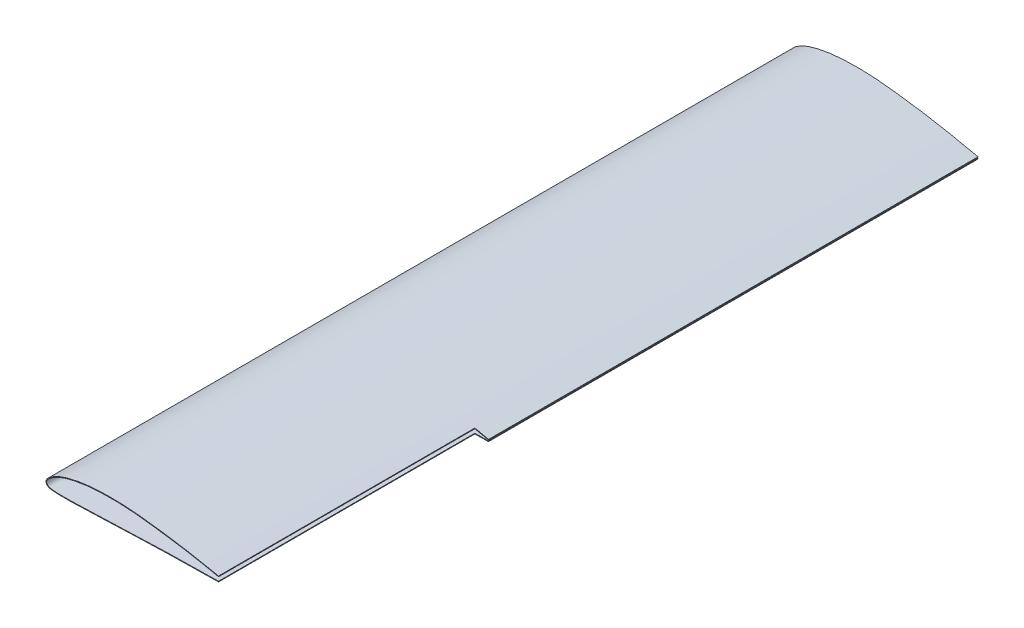
ISO-10303-21;
HEADER;
FILE_DESCRIPTION(('STEP AP214'),'2;1');
FILE_NAME('part.step','',(''),(''),'','','');
FILE_SCHEMA(('AUTOMOTIVE_DESIGN { 1 0 10303 214 1 1 1 1 }'));
ENDSEC;
DATA;
#1=APPLICATION_CONTEXT('core data for automotive mechanical design processes');
#2=APPLICATION_PROTOCOL_DEFINITION('international standard','automotive_design',2000,#1);
#3=PRODUCT_CONTEXT('',#1,'mechanical');
#4=PRODUCT('Part','Part','',(#3));
#5=PRODUCT_RELATED_PRODUCT_CATEGORY('part','',(#4));
#6=PRODUCT_DEFINITION_FORMATION('','',#4);
#7=PRODUCT_DEFINITION_CONTEXT('part definition',#1,'design');
#8=PRODUCT_DEFINITION('design','',#6,#7);
#9=PRODUCT_DEFINITION_SHAPE('','',#8);
#10=(LENGTH_UNIT() NAMED_UNIT(*) SI_UNIT(.MILLI.,.METRE.));
#11=(NAMED_UNIT(*) PLANE_ANGLE_UNIT() SI_UNIT($,.RADIAN.));
#12=(NAMED_UNIT(*) SI_UNIT($,.STERADIAN.) SOLID_ANGLE_UNIT());
#13=UNCERTAINTY_MEASURE_WITH_UNIT(LENGTH_MEASURE(1.E-05),#10,'distance_accuracy_value','');
#14=(GEOMETRIC_REPRESENTATION_CONTEXT(3) GLOBAL_UNCERTAINTY_ASSIGNED_CONTEXT((#13)) GLOBAL_UNIT_ASSIGNED_CONTEXT((#10,
#11,#12)) REPRESENTATION_CONTEXT('',''));
#15=CARTESIAN_POINT('',(0.,0.,0.));
#16=DIRECTION('',(0.,0.,1.));
#17=DIRECTION('',(1.,0.,0.));
#18=AXIS2_PLACEMENT_3D('',#15,#16,#17);
#19=CARTESIAN_POINT('',(152.092237140585,-4.00961778666245,1158.));
#20=DIRECTION('',(-0.976017079346762,0.217693961384825,0.));
#21=DIRECTION('',(-0.217693961384825,-0.976017079346762,0.));
#22=AXIS2_PLACEMENT_3D('',#19,#20,#21);
#23=PLANE('',#22);
#24=DIRECTION('',(0.217693961384825,0.976017079346762,0.));
#25=VECTOR('',#24,1.);
#26=CARTESIAN_POINT('',(152.092237140585,-4.00961778666245,760.));
#27=LINE('',#26,#25);
#28=CARTESIAN_POINT('',(151.8745431792,-4.98563486600921,760.));
#29=VERTEX_POINT('',#28);
#30=CARTESIAN_POINT('',(152.092237140585,-4.00961778666245,760.));
#31=VERTEX_POINT('',#30);
#32=EDGE_CURVE('E136',#29,#31,#27,.T.);
#33=ORIENTED_EDGE('',*,*,#32,.F.);
#34=DIRECTION('',(0.,0.,-1.));
#35=VECTOR('',#34,1.);
#36=CARTESIAN_POINT('',(151.8745431792,-4.98563486600921,1158.));
#37=LINE('',#36,#35);
#38=CARTESIAN_POINT('',(151.8745431792,-4.98563486600921,0.));
#39=VERTEX_POINT('',#38);
#40=EDGE_CURVE('E183',#29,#39,#37,.T.);
#41=ORIENTED_EDGE('',*,*,#40,.T.);
#42=DIRECTION('',(0.217693961384825,0.976017079346762,0.));
#43=VECTOR('',#42,1.);
#44=CARTESIAN_POINT('',(152.092237140585,-4.00961778666245,0.));
#45=LINE('',#44,#43);
#46=CARTESIAN_POINT('',(152.092237140585,-4.00961778666245,0.));
#47=VERTEX_POINT('',#46);
#48=EDGE_CURVE('E202',#39,#47,#45,.T.);
#49=ORIENTED_EDGE('',*,*,#48,.T.);
#50=DIRECTION('',(0.,0.,-1.));
#51=VECTOR('',#50,1.);
#52=CARTESIAN_POINT('',(152.092237140585,-4.00961778666245,1158.));
#53=LINE('',#52,#51);
#54=EDGE_CURVE('E185',#31,#47,#53,.T.);
#55=ORIENTED_EDGE('',*,*,#54,.F.);
#56=EDGE_LOOP('',(#33,#41,#49,#55));
#57=FACE_BOUND('',#56,.T.);
#58=ADVANCED_FACE('F41',(#57),#23,.F.);
#59=CARTESIAN_POINT('',(151.874543179201,-6.19181803951944,1158.));
#60=DIRECTION('',(-0.999993286381376,-0.00366431332918249,0.));
#61=DIRECTION('',(0.00366431332918249,-0.999993286381376,0.));
#62=AXIS2_PLACEMENT_3D('',#59,#60,#61);
#63=PLANE('',#62);
#64=DIRECTION('',(-0.00366431332918249,0.999993286381376,0.));
#65=VECTOR('',#64,1.);
#66=CARTESIAN_POINT('',(151.874543179201,-6.19181803951944,760.));
#67=LINE('',#66,#65);
#68=CARTESIAN_POINT('',(151.87820749253,-7.19181132590081,760.));
#69=VERTEX_POINT('',#68);
#70=CARTESIAN_POINT('',(151.874543179201,-6.19181803951944,760.));
#71=VERTEX_POINT('',#70);
#72=EDGE_CURVE('E11',#69,#71,#67,.T.);
#73=ORIENTED_EDGE('',*,*,#72,.F.);
#74=DIRECTION('',(0.,0.,-1.));
#75=VECTOR('',#74,1.);
#76=CARTESIAN_POINT('',(151.87820749253,-7.19181132590081,1158.));
#77=LINE('',#76,#75);
#78=CARTESIAN_POINT('',(151.87820749253,-7.19181132590081,0.));
#79=VERTEX_POINT('',#78);
#80=EDGE_CURVE('E127',#69,#79,#77,.T.);
#81=ORIENTED_EDGE('',*,*,#80,.T.);
#82=DIRECTION('',(-0.00366431332918249,0.999993286381377,0.));
#83=VECTOR('',#82,1.);
#84=CARTESIAN_POINT('',(151.874543179201,-6.19181803951944,0.));
#85=LINE('',#84,#83);
#86=CARTESIAN_POINT('',(151.874543179201,-6.19181803951944,0.));
#87=VERTEX_POINT('',#86);
#88=EDGE_CURVE('E152',#79,#87,#85,.T.);
#89=ORIENTED_EDGE('',*,*,#88,.T.);
#90=DIRECTION('',(0.,0.,-1.));
#91=VECTOR('',#90,1.);
#92=CARTESIAN_POINT('',(151.874543179201,-6.19181803951944,1158.));
#93=LINE('',#92,#91);
#94=EDGE_CURVE('E160',#71,#87,#93,.T.);
#95=ORIENTED_EDGE('',*,*,#94,.F.);
#96=EDGE_LOOP('',(#73,#81,#89,#95));
#97=FACE_BOUND('',#96,.T.);
#98=ADVANCED_FACE('F171',(#97),#63,.F.);
#99=CARTESIAN_POINT('',(151.874543179201,-6.19181803951944,1158.));
#100=CARTESIAN_POINT('',(145.699314534516,-6.21444616406944,1158.));
#101=CARTESIAN_POINT('',(133.346397408271,-6.37271787156871,1158.));
#102=CARTESIAN_POINT('',(114.835719112416,-6.54522407985408,1158.));
#103=CARTESIAN_POINT('',(96.3085394930478,-6.78926516234627,1158.));
#104=CARTESIAN_POINT('',(77.7911261127186,-7.18208515890731,1158.));
#105=CARTESIAN_POINT('',(59.2779352796809,-7.57675816210679,1158.));
#106=CARTESIAN_POINT('',(40.7587170980491,-8.02437411745174,1158.));
#107=CARTESIAN_POINT('',(22.2430709925931,-8.60597054264756,1158.));
#108=CARTESIAN_POINT('',(3.73237915182381,-9.29737087027167,1158.));
#109=CARTESIAN_POINT('',(-14.7708318059996,-10.0499916489246,1158.));
#110=CARTESIAN_POINT('',(-33.2723359248287,-10.7749838577894,1158.));
#111=CARTESIAN_POINT('',(-48.6894583080978,-11.3178363123618,1158.));
#112=CARTESIAN_POINT('',(-61.0289002653787,-11.7235966256034,1158.));
#113=CARTESIAN_POINT('',(-70.2848023502458,-12.0448151306389,1158.));
#114=CARTESIAN_POINT('',(-79.5455208542287,-12.414871640685,1158.));
#115=CARTESIAN_POINT('',(-88.7886437698428,-12.8239773342361,1158.));
#116=CARTESIAN_POINT('',(-98.0181818515425,-13.0426173029491,1158.));
#117=CARTESIAN_POINT('',(-105.72807665216,-13.0821867553433,1158.));
#118=CARTESIAN_POINT('',(-111.893999304147,-13.0888294970366,1158.));
#119=CARTESIAN_POINT('',(-116.515931844683,-13.0630177051306,1158.));
#120=CARTESIAN_POINT('',(-121.105324462135,-12.9445431243047,1158.));
#121=CARTESIAN_POINT('',(-124.905484956067,-12.644778535224,1158.));
#122=CARTESIAN_POINT('',(-127.916422200291,-12.2567199800539,1158.));
#123=CARTESIAN_POINT('',(-130.197889803794,-11.9074788154325,1158.));
#124=CARTESIAN_POINT('',(-132.271203820964,-11.4212366606267,1158.));
#125=CARTESIAN_POINT('',(-133.982317212742,-10.4029717494677,1158.));
#126=CARTESIAN_POINT('',(-135.379605451315,-8.87346632128209,1158.));
#127=CARTESIAN_POINT('',(-136.219555696713,-7.06752765707473,1158.));
#128=CARTESIAN_POINT('',(-136.156536255967,-5.22231186523403,1158.));
#129=CARTESIAN_POINT('',(-135.311630844482,-3.33114998061333,1158.));
#130=CARTESIAN_POINT('',(-134.025396381549,-1.60126285307151,1158.));
#131=CARTESIAN_POINT('',(-131.971777484134,0.514514818921397,1158.));
#132=CARTESIAN_POINT('',(-128.985342491234,2.7585148256388,1158.));
#133=CARTESIAN_POINT('',(-125.085160108037,5.14488572109271,1158.));
#134=CARTESIAN_POINT('',(-121.04651483172,7.33803208448006,1158.));
#135=CARTESIAN_POINT('',(-116.950627822324,9.40606846235749,1158.));
#136=CARTESIAN_POINT('',(-112.763475735126,11.1815602097575,1158.));
#137=CARTESIAN_POINT('',(-108.428105159987,12.6437576057185,1158.));
#138=CARTESIAN_POINT('',(-102.543462483832,14.3730419978637,1158.));
#139=CARTESIAN_POINT('',(-95.0915132969047,16.1982070395995,1158.));
#140=CARTESIAN_POINT('',(-86.0444657323198,17.9962277149986,1158.));
#141=CARTESIAN_POINT('',(-76.9395947683824,19.424387180606,1158.));
#142=CARTESIAN_POINT('',(-64.7221094599547,20.7846438876653,1158.));
#143=CARTESIAN_POINT('',(-49.3536305199083,21.6281573235743,1158.));
#144=CARTESIAN_POINT('',(-30.8708332491112,21.8740853176959,1158.));
#145=CARTESIAN_POINT('',(-12.4132177622546,21.2418991812219,1158.));
#146=CARTESIAN_POINT('',(6.00243544811213,19.6713100803249,1158.));
#147=CARTESIAN_POINT('',(24.3777058611296,17.5567339203518,1158.));
#148=CARTESIAN_POINT('',(42.7251145249837,15.1222675829138,1158.));
#149=CARTESIAN_POINT('',(61.0574167381434,12.5696695005642,1158.));
#150=CARTESIAN_POINT('',(79.3230217719693,9.67703327871308,1158.));
#151=CARTESIAN_POINT('',(97.5227911501051,6.35090569067019,1158.));
#152=CARTESIAN_POINT('',(121.73609733375,1.59573942851995,1158.));
#153=CARTESIAN_POINT('',(139.83185762362,-2.29959588187493,1158.));
#154=CARTESIAN_POINT('',(151.8745431792,-4.98563486600921,1158.));
#155=B_SPLINE_CURVE_WITH_KNOTS('',3,(#99,#100,#101,#102,#103,#104,#105,#106,#107,#108,#109,#110,
#111,#112,#113,#114,#115,#116,#117,#118,#119,#120,#121,#122,#123,#124,#125,#126,#127,#128,#129,
#130,#131,#132,#133,#134,#135,#136,#137,#138,#139,#140,#141,#142,#143,#144,#145,#146,#147,#148,
#149,#150,#151,#152,#153,#154),.UNSPECIFIED.,.F.,.F.,(4,1,1,1,1,1,1,1,1,1,1,1,1,1,1,1,1,1,1,1,1,
1,1,1,1,1,1,1,1,1,1,1,1,1,1,1,1,1,1,1,1,1,1,1,1,1,1,1,1,1,1,1,1,4),(0.0179783546014267,
0.0481074324162377,0.0782365102310486,0.10836558804586,0.138494665860671,0.168623743675482,
0.198752821490293,0.228881899305103,0.259010977119914,0.289140054934725,0.319269132749536,
0.349398210564347,0.364462749471753,0.379527288379158,0.394591827286564,0.409656366193969,
0.424720905101375,0.43978544400878,0.447317713462483,0.454849982916186,0.462382252369888,
0.469914521823591,0.473680656550443,0.477446791277294,0.481212926004145,0.484979060730997,
0.488745195457848,0.4925113301847,0.496277464911551,0.500043599638402,0.503809734365254,
0.507575869092105,0.515108138545808,0.522640407999511,0.530172677453213,0.537704946906916,
0.545237216360619,0.552769485814322,0.560301755268024,0.57536629417543,0.590430833082835,
0.605495371990241,0.620559910897646,0.650688988712457,0.680818066527268,0.710947144342079,
0.74107622215689,0.771205299971701,0.801334377786512,0.831463455601323,0.861592533416134,
0.891721611230945,0.921850689045756,0.982108844675378),.UNSPECIFIED.);
#156=DIRECTION('',(0.,0.,-1.));
#157=VECTOR('',#156,1.);
#158=SURFACE_OF_LINEAR_EXTRUSION('',#155,#157);
#159=CARTESIAN_POINT('',(130.78759603773,-6.38969409663401,1158.));
#160=VERTEX_POINT('',#159);
#161=CARTESIAN_POINT('',(130.787596037725,-0.389694095556437,1158.));
#162=VERTEX_POINT('',#161);
#163=EDGE_CURVE('E145',#160,#162,#155,.T.);
#164=ORIENTED_EDGE('',*,*,#163,.F.);
#165=DIRECTION('',(0.,0.,-1.));
#166=VECTOR('',#165,1.);
#167=CARTESIAN_POINT('',(130.787596037725,-6.38969409663407,1158.));
#168=LINE('',#167,#166);
#169=CARTESIAN_POINT('',(130.787596037725,-6.38969409663401,760.));
#170=VERTEX_POINT('',#169);
#171=EDGE_CURVE('E65',#160,#170,#168,.T.);
#172=ORIENTED_EDGE('',*,*,#171,.T.);
#173=CARTESIAN_POINT('',(151.874543179201,-6.19181803951944,760.));
#174=CARTESIAN_POINT('',(145.699314534516,-6.21444616406944,760.));
#175=CARTESIAN_POINT('',(133.346397408271,-6.37271787156871,760.));
#176=CARTESIAN_POINT('',(114.835719112416,-6.54522407985408,760.));
#177=CARTESIAN_POINT('',(96.3085394930478,-6.78926516234627,760.));
#178=CARTESIAN_POINT('',(77.7911261127186,-7.18208515890731,760.));
#179=CARTESIAN_POINT('',(59.2779352796809,-7.57675816210679,760.));
#180=CARTESIAN_POINT('',(40.7587170980491,-8.02437411745174,760.));
#181=CARTESIAN_POINT('',(22.2430709925931,-8.60597054264756,760.));
#182=CARTESIAN_POINT('',(3.73237915182381,-9.29737087027167,760.));
#183=CARTESIAN_POINT('',(-14.7708318059996,-10.0499916489246,760.));
#184=CARTESIAN_POINT('',(-33.2723359248287,-10.7749838577894,760.));
#185=CARTESIAN_POINT('',(-48.6894583080978,-11.3178363123618,760.));
#186=CARTESIAN_POINT('',(-61.0289002653787,-11.7235966256034,760.));
#187=CARTESIAN_POINT('',(-70.2848023502458,-12.0448151306389,760.));
#188=CARTESIAN_POINT('',(-79.5455208542287,-12.414871640685,760.));
#189=CARTESIAN_POINT('',(-88.7886437698428,-12.8239773342361,760.));
#190=CARTESIAN_POINT('',(-98.0181818515425,-13.0426173029491,760.));
#191=CARTESIAN_POINT('',(-105.72807665216,-13.0821867553433,760.));
#192=CARTESIAN_POINT('',(-111.893999304147,-13.0888294970366,760.));
#193=CARTESIAN_POINT('',(-116.515931844683,-13.0630177051306,760.));
#194=CARTESIAN_POINT('',(-121.105324462135,-12.9445431243047,760.));
#195=CARTESIAN_POINT('',(-124.905484956067,-12.644778535224,760.));
#196=CARTESIAN_POINT('',(-127.916422200291,-12.2567199800539,760.));
#197=CARTESIAN_POINT('',(-130.197889803794,-11.9074788154325,760.));
#198=CARTESIAN_POINT('',(-132.271203820964,-11.4212366606267,760.));
#199=CARTESIAN_POINT('',(-133.982317212742,-10.4029717494677,760.));
#200=CARTESIAN_POINT('',(-135.379605451315,-8.87346632128209,760.));
#201=CARTESIAN_POINT('',(-136.219555696713,-7.06752765707473,760.));
#202=CARTESIAN_POINT('',(-136.156536255967,-5.22231186523403,760.));
#203=CARTESIAN_POINT('',(-135.311630844482,-3.33114998061333,760.));
#204=CARTESIAN_POINT('',(-134.025396381549,-1.60126285307151,760.));
#205=CARTESIAN_POINT('',(-131.971777484134,0.514514818921397,760.));
#206=CARTESIAN_POINT('',(-128.985342491234,2.7585148256388,760.));
#207=CARTESIAN_POINT('',(-125.085160108037,5.14488572109271,760.));
#208=CARTESIAN_POINT('',(-121.04651483172,7.33803208448006,760.));
#209=CARTESIAN_POINT('',(-116.950627822324,9.40606846235749,760.));
#210=CARTESIAN_POINT('',(-112.763475735126,11.1815602097575,760.));
#211=CARTESIAN_POINT('',(-108.428105159987,12.6437576057185,760.));
#212=CARTESIAN_POINT('',(-102.543462483832,14.3730419978637,760.));
#213=CARTESIAN_POINT('',(-95.0915132969047,16.1982070395995,760.));
#214=CARTESIAN_POINT('',(-86.0444657323198,17.9962277149986,760.));
#215=CARTESIAN_POINT('',(-76.9395947683824,19.424387180606,760.));
#216=CARTESIAN_POINT('',(-64.7221094599547,20.7846438876653,760.));
#217=CARTESIAN_POINT('',(-49.3536305199083,21.6281573235743,760.));
#218=CARTESIAN_POINT('',(-30.8708332491112,21.8740853176959,760.));
#219=CARTESIAN_POINT('',(-12.4132177622546,21.2418991812219,760.));
#220=CARTESIAN_POINT('',(6.00243544811213,19.6713100803249,760.));
#221=CARTESIAN_POINT('',(24.3777058611296,17.5567339203518,760.));
#222=CARTESIAN_POINT('',(42.7251145249837,15.1222675829138,760.));
#223=CARTESIAN_POINT('',(61.0574167381434,12.5696695005642,760.));
#224=CARTESIAN_POINT('',(79.3230217719693,9.67703327871308,760.));
#225=CARTESIAN_POINT('',(97.5227911501051,6.35090569067019,760.));
#226=CARTESIAN_POINT('',(121.73609733375,1.59573942851995,760.));
#227=CARTESIAN_POINT('',(139.83185762362,-2.29959588187493,760.));
#228=CARTESIAN_POINT('',(151.8745431792,-4.98563486600921,760.));
#229=B_SPLINE_CURVE_WITH_KNOTS('',3,(#173,#174,#175,#176,#177,#178,#179,#180,#181,#182,#183,
#184,#185,#186,#187,#188,#189,#190,#191,#192,#193,#194,#195,#196,#197,#198,#199,#200,#201,#202,
#203,#204,#205,#206,#207,#208,#209,#210,#211,#212,#213,#214,#215,#216,#217,#218,#219,#220,#221,
#222,#223,#224,#225,#226,#227,#228),.UNSPECIFIED.,.F.,.F.,(4,1,1,1,1,1,1,1,1,1,1,1,1,1,1,1,1,1,
1,1,1,1,1,1,1,1,1,1,1,1,1,1,1,1,1,1,1,1,1,1,1,1,1,1,1,1,1,1,1,1,1,1,1,4),(0.0179783546014267,
0.0481074324162377,0.0782365102310486,0.10836558804586,0.138494665860671,0.168623743675482,
0.198752821490293,0.228881899305103,0.259010977119914,0.289140054934725,0.319269132749536,
0.349398210564347,0.364462749471753,0.379527288379158,0.394591827286564,0.409656366193969,
0.424720905101375,0.43978544400878,0.447317713462483,0.454849982916186,0.462382252369888,
0.469914521823591,0.473680656550443,0.477446791277294,0.481212926004145,0.484979060730997,
0.488745195457848,0.4925113301847,0.496277464911551,0.500043599638402,0.503809734365254,
0.507575869092105,0.515108138545808,0.522640407999511,0.530172677453213,0.537704946906916,
0.545237216360619,0.552769485814322,0.560301755268024,0.57536629417543,0.590430833082835,
0.605495371990241,0.620559910897646,0.650688988712457,0.680818066527268,0.710947144342079,
0.74107622215689,0.771205299971701,0.801334377786512,0.831463455601323,0.861592533416134,
0.891721611230945,0.921850689045756,0.982108844675378),.UNSPECIFIED.);
#230=EDGE_CURVE('E113',#71,#170,#229,.T.);
#231=ORIENTED_EDGE('',*,*,#230,.F.);
#232=ORIENTED_EDGE('',*,*,#94,.T.);
#233=CARTESIAN_POINT('',(151.874543179201,-6.19181803951944,0.));
#234=CARTESIAN_POINT('',(145.699314534516,-6.21444616406944,0.));
#235=CARTESIAN_POINT('',(133.346397408271,-6.37271787156871,0.));
#236=CARTESIAN_POINT('',(114.835719112416,-6.54522407985408,0.));
#237=CARTESIAN_POINT('',(96.3085394930478,-6.78926516234627,0.));
#238=CARTESIAN_POINT('',(77.7911261127186,-7.18208515890731,0.));
#239=CARTESIAN_POINT('',(59.2779352796809,-7.57675816210679,0.));
#240=CARTESIAN_POINT('',(40.7587170980491,-8.02437411745174,0.));
#241=CARTESIAN_POINT('',(22.2430709925931,-8.60597054264756,0.));
#242=CARTESIAN_POINT('',(3.73237915182381,-9.29737087027167,0.));
#243=CARTESIAN_POINT('',(-14.7708318059996,-10.0499916489246,0.));
#244=CARTESIAN_POINT('',(-33.2723359248287,-10.7749838577894,0.));
#245=CARTESIAN_POINT('',(-48.6894583080978,-11.3178363123618,0.));
#246=CARTESIAN_POINT('',(-61.0289002653787,-11.7235966256034,0.));
#247=CARTESIAN_POINT('',(-70.2848023502458,-12.0448151306389,0.));
#248=CARTESIAN_POINT('',(-79.5455208542287,-12.414871640685,0.));
#249=CARTESIAN_POINT('',(-88.7886437698428,-12.8239773342361,0.));
#250=CARTESIAN_POINT('',(-98.0181818515425,-13.0426173029491,0.));
#251=CARTESIAN_POINT('',(-105.72807665216,-13.0821867553433,0.));
#252=CARTESIAN_POINT('',(-111.893999304147,-13.0888294970366,0.));
#253=CARTESIAN_POINT('',(-116.515931844683,-13.0630177051306,0.));
#254=CARTESIAN_POINT('',(-121.105324462135,-12.9445431243047,0.));
#255=CARTESIAN_POINT('',(-124.905484956067,-12.644778535224,0.));
#256=CARTESIAN_POINT('',(-127.916422200291,-12.2567199800539,0.));
#257=CARTESIAN_POINT('',(-130.197889803794,-11.9074788154325,0.));
#258=CARTESIAN_POINT('',(-132.271203820964,-11.4212366606267,0.));
#259=CARTESIAN_POINT('',(-133.982317212742,-10.4029717494677,0.));
#260=CARTESIAN_POINT('',(-135.379605451315,-8.87346632128209,0.));
#261=CARTESIAN_POINT('',(-136.219555696713,-7.06752765707473,0.));
#262=CARTESIAN_POINT('',(-136.156536255967,-5.22231186523403,0.));
#263=CARTESIAN_POINT('',(-135.311630844482,-3.33114998061333,0.));
#264=CARTESIAN_POINT('',(-134.025396381549,-1.60126285307151,0.));
#265=CARTESIAN_POINT('',(-131.971777484134,0.514514818921397,0.));
#266=CARTESIAN_POINT('',(-128.985342491234,2.7585148256388,0.));
#267=CARTESIAN_POINT('',(-125.085160108037,5.14488572109271,0.));
#268=CARTESIAN_POINT('',(-121.04651483172,7.33803208448006,0.));
#269=CARTESIAN_POINT('',(-116.950627822324,9.40606846235749,0.));
#270=CARTESIAN_POINT('',(-112.763475735126,11.1815602097575,0.));
#271=CARTESIAN_POINT('',(-108.428105159987,12.6437576057185,0.));
#272=CARTESIAN_POINT('',(-102.543462483832,14.3730419978637,0.));
#273=CARTESIAN_POINT('',(-95.0915132969047,16.1982070395995,0.));
#274=CARTESIAN_POINT('',(-86.0444657323198,17.9962277149986,0.));
#275=CARTESIAN_POINT('',(-76.9395947683824,19.424387180606,0.));
#276=CARTESIAN_POINT('',(-64.7221094599547,20.7846438876653,0.));
#277=CARTESIAN_POINT('',(-49.3536305199083,21.6281573235743,0.));
#278=CARTESIAN_POINT('',(-30.8708332491112,21.8740853176959,0.));
#279=CARTESIAN_POINT('',(-12.4132177622546,21.2418991812219,0.));
#280=CARTESIAN_POINT('',(6.00243544811213,19.6713100803249,0.));
#281=CARTESIAN_POINT('',(24.3777058611296,17.5567339203518,0.));
#282=CARTESIAN_POINT('',(42.7251145249837,15.1222675829138,0.));
#283=CARTESIAN_POINT('',(61.0574167381434,12.5696695005642,0.));
#284=CARTESIAN_POINT('',(79.3230217719693,9.67703327871308,0.));
#285=CARTESIAN_POINT('',(97.5227911501051,6.35090569067019,0.));
#286=CARTESIAN_POINT('',(121.73609733375,1.59573942851995,0.));
#287=CARTESIAN_POINT('',(139.83185762362,-2.29959588187493,0.));
#288=CARTESIAN_POINT('',(151.8745431792,-4.98563486600921,0.));
#289=B_SPLINE_CURVE_WITH_KNOTS('',3,(#233,#234,#235,#236,#237,#238,#239,#240,#241,#242,#243,
#244,#245,#246,#247,#248,#249,#250,#251,#252,#253,#254,#255,#256,#257,#258,#259,#260,#261,#262,
#263,#264,#265,#266,#267,#268,#269,#270,#271,#272,#273,#274,#275,#276,#277,#278,#279,#280,#281,
#282,#283,#284,#285,#286,#287,#288),.UNSPECIFIED.,.F.,.F.,(4,1,1,1,1,1,1,1,1,1,1,1,1,1,1,1,1,1,
1,1,1,1,1,1,1,1,1,1,1,1,1,1,1,1,1,1,1,1,1,1,1,1,1,1,1,1,1,1,1,1,1,1,1,4),(0.0179783546014267,
0.0481074324162377,0.0782365102310486,0.10836558804586,0.138494665860671,0.168623743675482,
0.198752821490293,0.228881899305103,0.259010977119914,0.289140054934725,0.319269132749536,
0.349398210564347,0.364462749471753,0.379527288379158,0.394591827286564,0.409656366193969,
0.424720905101375,0.43978544400878,0.447317713462483,0.454849982916186,0.462382252369888,
0.469914521823591,0.473680656550443,0.477446791277294,0.481212926004145,0.484979060730997,
0.488745195457848,0.4925113301847,0.496277464911551,0.500043599638402,0.503809734365254,
0.507575869092105,0.515108138545808,0.522640407999511,0.530172677453213,0.537704946906916,
0.545237216360619,0.552769485814322,0.560301755268024,0.57536629417543,0.590430833082835,
0.605495371990241,0.620559910897646,0.650688988712457,0.680818066527268,0.710947144342079,
0.74107622215689,0.771205299971701,0.801334377786512,0.831463455601323,0.861592533416134,
0.891721611230945,0.921850689045756,0.982108844675378),.UNSPECIFIED.);
#290=EDGE_CURVE('E142',#87,#39,#289,.T.);
#291=ORIENTED_EDGE('',*,*,#290,.T.);
#292=ORIENTED_EDGE('',*,*,#40,.F.);
#293=CARTESIAN_POINT('',(130.787596037725,-0.389694095556451,760.));
#294=VERTEX_POINT('',#293);
#295=EDGE_CURVE('E131',#294,#29,#229,.T.);
#296=ORIENTED_EDGE('',*,*,#295,.F.);
#297=DIRECTION('',(0.,0.,-1.));
#298=VECTOR('',#297,1.);
#299=CARTESIAN_POINT('',(130.787596037725,-0.389694096634226,1158.));
#300=LINE('',#299,#298);
#301=EDGE_CURVE('E132',#294,#162,#300,.F.);
#302=ORIENTED_EDGE('',*,*,#301,.T.);
#303=EDGE_LOOP('',(#164,#172,#231,#232,#291,#292,#296,#302));
#304=FACE_BOUND('',#303,.T.);
#305=ADVANCED_FACE('F43',(#304),#158,.F.);
#306=CARTESIAN_POINT('',(152.092237140585,-4.00961778666245,1158.));
#307=CARTESIAN_POINT('',(140.043208955243,-1.32216412216276,1158.));
#308=CARTESIAN_POINT('',(121.938945821571,2.5749930540764,1158.));
#309=CARTESIAN_POINT('',(97.7101366951378,7.33323205226818,1158.));
#310=CARTESIAN_POINT('',(79.4921503819107,10.6627234555463,1158.));
#311=CARTESIAN_POINT('',(61.202227270709,13.5591900929581,1158.));
#312=CARTESIAN_POINT('',(42.8597362447313,16.1131664103611,1158.));
#313=CARTESIAN_POINT('',(24.5027461538476,18.5489178555066,1158.));
#314=CARTESIAN_POINT('',(6.10526806172969,20.6661631785407,1158.));
#315=CARTESIAN_POINT('',(-12.351590500784,22.2404283444848,1158.));
#316=CARTESIAN_POINT('',(-30.8623782903272,22.8744378636461,1158.));
#317=CARTESIAN_POINT('',(-46.2990160098561,22.6689813139366,1158.));
#318=CARTESIAN_POINT('',(-58.6320354908042,22.1205340305492,1158.));
#319=CARTESIAN_POINT('',(-67.8670537976824,21.4407162409951,1158.));
#320=CARTESIAN_POINT('',(-77.072274605977,20.4158835803392,1158.));
#321=CARTESIAN_POINT('',(-86.2201921877069,18.9809333963528,1158.));
#322=CARTESIAN_POINT('',(-95.305866560519,17.1753093704217,1158.));
#323=CARTESIAN_POINT('',(-102.800454024853,15.3397727008447,1158.));
#324=CARTESIAN_POINT('',(-108.724592315502,13.599050145645,1158.));
#325=CARTESIAN_POINT('',(-113.115287949961,12.1186971430074,1158.));
#326=CARTESIAN_POINT('',(-117.377698345722,10.3111196571414,1158.));
#327=CARTESIAN_POINT('',(-121.511916057336,8.22328830943407,1158.));
#328=CARTESIAN_POINT('',(-125.580648292778,6.013735118857,1158.));
#329=CARTESIAN_POINT('',(-129.536040508862,3.5951376341647,1158.));
#330=CARTESIAN_POINT('',(-132.622806238822,1.27833961893195,1158.));
#331=CARTESIAN_POINT('',(-134.78373952453,-0.944145997128696,1158.));
#332=CARTESIAN_POINT('',(-136.167116486637,-2.80509347725021,1158.));
#333=CARTESIAN_POINT('',(-137.147162333934,-4.94035533027691,1158.));
#334=CARTESIAN_POINT('',(-137.231902245328,-7.30466181657852,1158.));
#335=CARTESIAN_POINT('',(-136.208199491687,-9.45566960432125,1158.));
#336=CARTESIAN_POINT('',(-134.638492916764,-11.1792876722372,1158.));
#337=CARTESIAN_POINT('',(-132.621385533967,-12.3741953966846,1158.));
#338=CARTESIAN_POINT('',(-130.357560477713,-12.8948820120433,1158.));
#339=CARTESIAN_POINT('',(-128.058065355621,-13.2466820932409,1158.));
#340=CARTESIAN_POINT('',(-125.007225470772,-13.6400518711027,1158.));
#341=CARTESIAN_POINT('',(-121.152604521625,-13.9438892773167,1158.));
#342=CARTESIAN_POINT('',(-116.52733439743,-14.0629965557833,1158.));
#343=CARTESIAN_POINT('',(-111.895081620037,-14.0888319923629,1158.));
#344=CARTESIAN_POINT('',(-105.724762049471,-14.0821805149052,1158.));
#345=CARTESIAN_POINT('',(-98.0061626479719,-14.0426167300536,1158.));
#346=CARTESIAN_POINT('',(-88.7519061502923,-13.8233650586431,1158.));
#347=CARTESIAN_POINT('',(-79.5007136635146,-13.413859899689,1158.));
#348=CARTESIAN_POINT('',(-70.2483436262266,-13.0441621490453,1158.));
#349=CARTESIAN_POINT('',(-60.9957022222312,-12.7230434721735,1158.));
#350=CARTESIAN_POINT('',(-48.6559963874721,-12.3172773280655,1158.));
#351=CARTESIAN_POINT('',(-33.2348857610807,-11.7742907876524,1158.));
#352=CARTESIAN_POINT('',(-14.7302609032701,-11.0491492484601,1158.));
#353=CARTESIAN_POINT('',(3.77203699162043,-10.2966559447239,1158.));
#354=CARTESIAN_POINT('',(22.2777684294147,-9.60511182278893,1158.));
#355=CARTESIAN_POINT('',(46.9559875431848,-8.83160397343114,1158.));
#356=CARTESIAN_POINT('',(71.6421184827174,-8.31414410008644,1158.));
#357=CARTESIAN_POINT('',(96.3265689738578,-7.78885067710672,1158.));
#358=CARTESIAN_POINT('',(114.844631407384,-7.54525996391324,1158.));
#359=CARTESIAN_POINT('',(133.360193645978,-7.37260940341575,1158.));
#360=CARTESIAN_POINT('',(145.705446153918,-7.21443040940759,1158.));
#361=CARTESIAN_POINT('',(151.87820749253,-7.19181132590081,1158.));
#362=B_SPLINE_CURVE_WITH_KNOTS('',3,(#306,#307,#308,#309,#310,#311,#312,#313,#314,#315,#316,
#317,#318,#319,#320,#321,#322,#323,#324,#325,#326,#327,#328,#329,#330,#331,#332,#333,#334,#335,
#336,#337,#338,#339,#340,#341,#342,#343,#344,#345,#346,#347,#348,#349,#350,#351,#352,#353,#354,
#355,#356,#357,#358,#359,#360,#361),.UNSPECIFIED.,.F.,.F.,(4,1,1,1,1,1,1,1,1,1,1,1,1,1,1,1,1,1,
1,1,1,1,1,1,1,1,1,1,1,1,1,1,1,1,1,1,1,1,1,1,1,1,1,1,1,1,1,1,1,1,1,1,1,4),(0.0179783546014267,
0.0782365102310486,0.10836558804586,0.138494665860671,0.168623743675482,0.198752821490292,
0.228881899305103,0.259010977119914,0.289140054934725,0.319269132749536,0.349398210564347,
0.364462749471753,0.379527288379158,0.394591827286564,0.409656366193969,0.424720905101375,
0.43978544400878,0.447317713462483,0.454849982916186,0.462382252369888,0.469914521823591,
0.477446791277294,0.484979060730997,0.492511330184699,0.496277464911551,0.500043599638402,
0.503809734365253,0.507575869092105,0.511342003818956,0.515108138545808,0.518874273272659,
0.52264040799951,0.526406542726362,0.530172677453213,0.537704946906916,0.545237216360619,
0.552769485814321,0.560301755268024,0.57536629417543,0.590430833082835,0.605495371990241,
0.620559910897646,0.635624449805052,0.650688988712457,0.680818066527268,0.710947144342079,
0.74107622215689,0.771205299971701,0.801334377786512,0.861592533416134,0.891721611230945,
0.921850689045756,0.951979766860567,0.982108844675378),.UNSPECIFIED.);
#363=DIRECTION('',(0.,0.,-1.));
#364=VECTOR('',#363,1.);
#365=SURFACE_OF_LINEAR_EXTRUSION('',#362,#364);
#366=CARTESIAN_POINT('',(130.787600183326,0.632586768675778,1158.));
#367=VERTEX_POINT('',#366);
#368=CARTESIAN_POINT('',(130.787596037725,-7.38975681775536,1158.));
#369=VERTEX_POINT('',#368);
#370=EDGE_CURVE('E151',#367,#369,#362,.T.);
#371=ORIENTED_EDGE('',*,*,#370,.F.);
#372=DIRECTION('',(0.,0.,1.));
#373=VECTOR('',#372,1.);
#374=CARTESIAN_POINT('',(130.787596037725,0.632587648371267,760.));
#375=LINE('',#374,#373);
#376=CARTESIAN_POINT('',(130.787596037725,0.632587648371267,760.));
#377=VERTEX_POINT('',#376);
#378=EDGE_CURVE('E57',#377,#367,#375,.T.);
#379=ORIENTED_EDGE('',*,*,#378,.F.);
#380=CARTESIAN_POINT('',(152.092237140585,-4.00961778666245,760.));
#381=CARTESIAN_POINT('',(140.043208955243,-1.32216412216276,760.));
#382=CARTESIAN_POINT('',(121.938945821571,2.5749930540764,760.));
#383=CARTESIAN_POINT('',(97.7101366951378,7.33323205226818,760.));
#384=CARTESIAN_POINT('',(79.4921503819107,10.6627234555463,760.));
#385=CARTESIAN_POINT('',(61.202227270709,13.5591900929581,760.));
#386=CARTESIAN_POINT('',(42.8597362447313,16.1131664103611,760.));
#387=CARTESIAN_POINT('',(24.5027461538476,18.5489178555066,760.));
#388=CARTESIAN_POINT('',(6.10526806172969,20.6661631785407,760.));
#389=CARTESIAN_POINT('',(-12.351590500784,22.2404283444848,760.));
#390=CARTESIAN_POINT('',(-30.8623782903272,22.8744378636461,760.));
#391=CARTESIAN_POINT('',(-46.2990160098561,22.6689813139366,760.));
#392=CARTESIAN_POINT('',(-58.6320354908042,22.1205340305492,760.));
#393=CARTESIAN_POINT('',(-67.8670537976824,21.4407162409951,760.));
#394=CARTESIAN_POINT('',(-77.072274605977,20.4158835803392,760.));
#395=CARTESIAN_POINT('',(-86.2201921877069,18.9809333963528,760.));
#396=CARTESIAN_POINT('',(-95.305866560519,17.1753093704217,760.));
#397=CARTESIAN_POINT('',(-102.800454024853,15.3397727008447,760.));
#398=CARTESIAN_POINT('',(-108.724592315502,13.599050145645,760.));
#399=CARTESIAN_POINT('',(-113.115287949961,12.1186971430074,760.));
#400=CARTESIAN_POINT('',(-117.377698345722,10.3111196571414,760.));
#401=CARTESIAN_POINT('',(-121.511916057336,8.22328830943407,760.));
#402=CARTESIAN_POINT('',(-125.580648292778,6.013735118857,760.));
#403=CARTESIAN_POINT('',(-129.536040508862,3.5951376341647,760.));
#404=CARTESIAN_POINT('',(-132.622806238822,1.27833961893195,760.));
#405=CARTESIAN_POINT('',(-134.78373952453,-0.944145997128696,760.));
#406=CARTESIAN_POINT('',(-136.167116486637,-2.80509347725021,760.));
#407=CARTESIAN_POINT('',(-137.147162333934,-4.94035533027691,760.));
#408=CARTESIAN_POINT('',(-137.231902245328,-7.30466181657852,760.));
#409=CARTESIAN_POINT('',(-136.208199491687,-9.45566960432125,760.));
#410=CARTESIAN_POINT('',(-134.638492916764,-11.1792876722372,760.));
#411=CARTESIAN_POINT('',(-132.621385533967,-12.3741953966846,760.));
#412=CARTESIAN_POINT('',(-130.357560477713,-12.8948820120433,760.));
#413=CARTESIAN_POINT('',(-128.058065355621,-13.2466820932409,760.));
#414=CARTESIAN_POINT('',(-125.007225470772,-13.6400518711027,760.));
#415=CARTESIAN_POINT('',(-121.152604521625,-13.9438892773167,760.));
#416=CARTESIAN_POINT('',(-116.52733439743,-14.0629965557833,760.));
#417=CARTESIAN_POINT('',(-111.895081620037,-14.0888319923629,760.));
#418=CARTESIAN_POINT('',(-105.724762049471,-14.0821805149052,760.));
#419=CARTESIAN_POINT('',(-98.0061626479719,-14.0426167300536,760.));
#420=CARTESIAN_POINT('',(-88.7519061502923,-13.8233650586431,760.));
#421=CARTESIAN_POINT('',(-79.5007136635146,-13.413859899689,760.));
#422=CARTESIAN_POINT('',(-70.2483436262266,-13.0441621490453,760.));
#423=CARTESIAN_POINT('',(-60.9957022222312,-12.7230434721735,760.));
#424=CARTESIAN_POINT('',(-48.6559963874721,-12.3172773280655,760.));
#425=CARTESIAN_POINT('',(-33.2348857610807,-11.7742907876524,760.));
#426=CARTESIAN_POINT('',(-14.7302609032701,-11.0491492484601,760.));
#427=CARTESIAN_POINT('',(3.77203699162043,-10.2966559447239,760.));
#428=CARTESIAN_POINT('',(22.2777684294147,-9.60511182278893,760.));
#429=CARTESIAN_POINT('',(46.9559875431848,-8.83160397343114,760.));
#430=CARTESIAN_POINT('',(71.6421184827174,-8.31414410008644,760.));
#431=CARTESIAN_POINT('',(96.3265689738578,-7.78885067710672,760.));
#432=CARTESIAN_POINT('',(114.844631407384,-7.54525996391324,760.));
#433=CARTESIAN_POINT('',(133.360193645978,-7.37260940341575,760.));
#434=CARTESIAN_POINT('',(145.705446153918,-7.21443040940759,760.));
#435=CARTESIAN_POINT('',(151.87820749253,-7.19181132590081,760.));
#436=B_SPLINE_CURVE_WITH_KNOTS('',3,(#380,#381,#382,#383,#384,#385,#386,#387,#388,#389,#390,
#391,#392,#393,#394,#395,#396,#397,#398,#399,#400,#401,#402,#403,#404,#405,#406,#407,#408,#409,
#410,#411,#412,#413,#414,#415,#416,#417,#418,#419,#420,#421,#422,#423,#424,#425,#426,#427,#428,
#429,#430,#431,#432,#433,#434,#435),.UNSPECIFIED.,.F.,.F.,(4,1,1,1,1,1,1,1,1,1,1,1,1,1,1,1,1,1,
1,1,1,1,1,1,1,1,1,1,1,1,1,1,1,1,1,1,1,1,1,1,1,1,1,1,1,1,1,1,1,1,1,1,1,4),(0.0179783546014267,
0.0782365102310486,0.10836558804586,0.138494665860671,0.168623743675482,0.198752821490292,
0.228881899305103,0.259010977119914,0.289140054934725,0.319269132749536,0.349398210564347,
0.364462749471753,0.379527288379158,0.394591827286564,0.409656366193969,0.424720905101375,
0.43978544400878,0.447317713462483,0.454849982916186,0.462382252369888,0.469914521823591,
0.477446791277294,0.484979060730997,0.492511330184699,0.496277464911551,0.500043599638402,
0.503809734365253,0.507575869092105,0.511342003818956,0.515108138545808,0.518874273272659,
0.52264040799951,0.526406542726362,0.530172677453213,0.537704946906916,0.545237216360619,
0.552769485814321,0.560301755268024,0.57536629417543,0.590430833082835,0.605495371990241,
0.620559910897646,0.635624449805052,0.650688988712457,0.680818066527268,0.710947144342079,
0.74107622215689,0.771205299971701,0.801334377786512,0.861592533416134,0.891721611230945,
0.921850689045756,0.951979766860567,0.982108844675378),.UNSPECIFIED.);
#437=EDGE_CURVE('E129',#31,#377,#436,.T.);
#438=ORIENTED_EDGE('',*,*,#437,.F.);
#439=ORIENTED_EDGE('',*,*,#54,.T.);
#440=CARTESIAN_POINT('',(152.092237140585,-4.00961778666245,0.));
#441=CARTESIAN_POINT('',(140.043208955243,-1.32216412216276,0.));
#442=CARTESIAN_POINT('',(121.938945821571,2.5749930540764,0.));
#443=CARTESIAN_POINT('',(97.7101366951378,7.33323205226818,0.));
#444=CARTESIAN_POINT('',(79.4921503819107,10.6627234555463,0.));
#445=CARTESIAN_POINT('',(61.202227270709,13.5591900929581,0.));
#446=CARTESIAN_POINT('',(42.8597362447313,16.1131664103611,0.));
#447=CARTESIAN_POINT('',(24.5027461538476,18.5489178555066,0.));
#448=CARTESIAN_POINT('',(6.10526806172969,20.6661631785407,0.));
#449=CARTESIAN_POINT('',(-12.351590500784,22.2404283444848,0.));
#450=CARTESIAN_POINT('',(-30.8623782903272,22.8744378636461,0.));
#451=CARTESIAN_POINT('',(-46.2990160098561,22.6689813139366,0.));
#452=CARTESIAN_POINT('',(-58.6320354908042,22.1205340305492,0.));
#453=CARTESIAN_POINT('',(-67.8670537976824,21.4407162409951,0.));
#454=CARTESIAN_POINT('',(-77.072274605977,20.4158835803392,0.));
#455=CARTESIAN_POINT('',(-86.2201921877069,18.9809333963528,0.));
#456=CARTESIAN_POINT('',(-95.305866560519,17.1753093704217,0.));
#457=CARTESIAN_POINT('',(-102.800454024853,15.3397727008447,0.));
#458=CARTESIAN_POINT('',(-108.724592315502,13.599050145645,0.));
#459=CARTESIAN_POINT('',(-113.115287949961,12.1186971430074,0.));
#460=CARTESIAN_POINT('',(-117.377698345722,10.3111196571414,0.));
#461=CARTESIAN_POINT('',(-121.511916057336,8.22328830943407,0.));
#462=CARTESIAN_POINT('',(-125.580648292778,6.013735118857,0.));
#463=CARTESIAN_POINT('',(-129.536040508862,3.5951376341647,0.));
#464=CARTESIAN_POINT('',(-132.622806238822,1.27833961893195,0.));
#465=CARTESIAN_POINT('',(-134.78373952453,-0.944145997128696,0.));
#466=CARTESIAN_POINT('',(-136.167116486637,-2.80509347725021,0.));
#467=CARTESIAN_POINT('',(-137.147162333934,-4.94035533027691,0.));
#468=CARTESIAN_POINT('',(-137.231902245328,-7.30466181657852,0.));
#469=CARTESIAN_POINT('',(-136.208199491687,-9.45566960432125,0.));
#470=CARTESIAN_POINT('',(-134.638492916764,-11.1792876722372,0.));
#471=CARTESIAN_POINT('',(-132.621385533967,-12.3741953966846,0.));
#472=CARTESIAN_POINT('',(-130.357560477713,-12.8948820120433,0.));
#473=CARTESIAN_POINT('',(-128.058065355621,-13.2466820932409,0.));
#474=CARTESIAN_POINT('',(-125.007225470772,-13.6400518711027,0.));
#475=CARTESIAN_POINT('',(-121.152604521625,-13.9438892773167,0.));
#476=CARTESIAN_POINT('',(-116.52733439743,-14.0629965557833,0.));
#477=CARTESIAN_POINT('',(-111.895081620037,-14.0888319923629,0.));
#478=CARTESIAN_POINT('',(-105.724762049471,-14.0821805149052,0.));
#479=CARTESIAN_POINT('',(-98.0061626479719,-14.0426167300536,0.));
#480=CARTESIAN_POINT('',(-88.7519061502923,-13.8233650586431,0.));
#481=CARTESIAN_POINT('',(-79.5007136635146,-13.413859899689,0.));
#482=CARTESIAN_POINT('',(-70.2483436262266,-13.0441621490453,0.));
#483=CARTESIAN_POINT('',(-60.9957022222312,-12.7230434721735,0.));
#484=CARTESIAN_POINT('',(-48.6559963874721,-12.3172773280655,0.));
#485=CARTESIAN_POINT('',(-33.2348857610807,-11.7742907876524,0.));
#486=CARTESIAN_POINT('',(-14.7302609032701,-11.0491492484601,0.));
#487=CARTESIAN_POINT('',(3.77203699162043,-10.2966559447239,0.));
#488=CARTESIAN_POINT('',(22.2777684294147,-9.60511182278893,0.));
#489=CARTESIAN_POINT('',(46.9559875431848,-8.83160397343114,0.));
#490=CARTESIAN_POINT('',(71.6421184827174,-8.31414410008644,0.));
#491=CARTESIAN_POINT('',(96.3265689738578,-7.78885067710672,0.));
#492=CARTESIAN_POINT('',(114.844631407384,-7.54525996391324,0.));
#493=CARTESIAN_POINT('',(133.360193645978,-7.37260940341575,0.));
#494=CARTESIAN_POINT('',(145.705446153918,-7.21443040940759,0.));
#495=CARTESIAN_POINT('',(151.87820749253,-7.19181132590081,0.));
#496=B_SPLINE_CURVE_WITH_KNOTS('',3,(#440,#441,#442,#443,#444,#445,#446,#447,#448,#449,#450,
#451,#452,#453,#454,#455,#456,#457,#458,#459,#460,#461,#462,#463,#464,#465,#466,#467,#468,#469,
#470,#471,#472,#473,#474,#475,#476,#477,#478,#479,#480,#481,#482,#483,#484,#485,#486,#487,#488,
#489,#490,#491,#492,#493,#494,#495),.UNSPECIFIED.,.F.,.F.,(4,1,1,1,1,1,1,1,1,1,1,1,1,1,1,1,1,1,
1,1,1,1,1,1,1,1,1,1,1,1,1,1,1,1,1,1,1,1,1,1,1,1,1,1,1,1,1,1,1,1,1,1,1,4),(0.0179783546014267,
0.0782365102310486,0.10836558804586,0.138494665860671,0.168623743675482,0.198752821490292,
0.228881899305103,0.259010977119914,0.289140054934725,0.319269132749536,0.349398210564347,
0.364462749471753,0.379527288379158,0.394591827286564,0.409656366193969,0.424720905101375,
0.43978544400878,0.447317713462483,0.454849982916186,0.462382252369888,0.469914521823591,
0.477446791277294,0.484979060730997,0.492511330184699,0.496277464911551,0.500043599638402,
0.503809734365253,0.507575869092105,0.511342003818956,0.515108138545808,0.518874273272659,
0.52264040799951,0.526406542726362,0.530172677453213,0.537704946906916,0.545237216360619,
0.552769485814321,0.560301755268024,0.57536629417543,0.590430833082835,0.605495371990241,
0.620559910897646,0.635624449805052,0.650688988712457,0.680818066527268,0.710947144342079,
0.74107622215689,0.771205299971701,0.801334377786512,0.861592533416134,0.891721611230945,
0.921850689045756,0.951979766860567,0.982108844675378),.UNSPECIFIED.);
#497=EDGE_CURVE('E199',#47,#79,#496,.T.);
#498=ORIENTED_EDGE('',*,*,#497,.T.);
#499=ORIENTED_EDGE('',*,*,#80,.F.);
#500=CARTESIAN_POINT('',(130.787596037725,-7.38975681775536,760.));
#501=VERTEX_POINT('',#500);
#502=EDGE_CURVE('E110',#501,#69,#436,.T.);
#503=ORIENTED_EDGE('',*,*,#502,.F.);
#504=DIRECTION('',(0.,0.,1.));
#505=VECTOR('',#504,1.);
#506=CARTESIAN_POINT('',(130.787596037725,-7.38975681775536,760.));
#507=LINE('',#506,#505);
#508=EDGE_CURVE('E118',#501,#369,#507,.T.);
#509=ORIENTED_EDGE('',*,*,#508,.T.);
#510=EDGE_LOOP('',(#371,#379,#438,#439,#498,#499,#503,#509));
#511=FACE_BOUND('',#510,.T.);
#512=ADVANCED_FACE('F125',(#511),#365,.F.);
#513=CARTESIAN_POINT('',(-135.238076002574,-3.35802910679316,1158.));
#514=DIRECTION('',(0.,0.,-1.));
#515=DIRECTION('',(-1.,0.,0.));
#516=AXIS2_PLACEMENT_3D('',#513,#514,#515);
#517=PLANE('',#516);
#518=ORIENTED_EDGE('',*,*,#370,.T.);
#519=DIRECTION('',(0.,1.,0.));
#520=VECTOR('',#519,1.);
#521=CARTESIAN_POINT('',(130.787596037725,-3.35802910679224,1158.));
#522=LINE('',#521,#520);
#523=EDGE_CURVE('E50',#369,#160,#522,.T.);
#524=ORIENTED_EDGE('',*,*,#523,.T.);
#525=ORIENTED_EDGE('',*,*,#163,.T.);
#526=DIRECTION('',(0.,-1.,0.));
#527=VECTOR('',#526,1.);
#528=CARTESIAN_POINT('',(130.787596037725,0.632587648371267,1158.));
#529=LINE('',#528,#527);
#530=EDGE_CURVE('E115',#367,#162,#529,.T.);
#531=ORIENTED_EDGE('',*,*,#530,.F.);
#532=EDGE_LOOP('',(#518,#524,#525,#531));
#533=FACE_BOUND('',#532,.T.);
#534=ADVANCED_FACE('F170',(#533),#517,.F.);
#535=CARTESIAN_POINT('',(-135.238076002574,-3.35802910679316,0.));
#536=DIRECTION('',(0.,0.,-1.));
#537=DIRECTION('',(-1.,0.,0.));
#538=AXIS2_PLACEMENT_3D('',#535,#536,#537);
#539=PLANE('',#538);
#540=ORIENTED_EDGE('',*,*,#290,.F.);
#541=ORIENTED_EDGE('',*,*,#88,.F.);
#542=ORIENTED_EDGE('',*,*,#497,.F.);
#543=ORIENTED_EDGE('',*,*,#48,.F.);
#544=EDGE_LOOP('',(#540,#541,#542,#543));
#545=FACE_BOUND('',#544,.T.);
#546=ADVANCED_FACE('F209',(#545),#539,.T.);
#547=CARTESIAN_POINT('',(130.787596037725,0.632587648371267,760.));
#548=DIRECTION('',(-1.,0.,0.));
#549=DIRECTION('',(0.,-1.,0.));
#550=AXIS2_PLACEMENT_3D('',#547,#548,#549);
#551=PLANE('',#550);
#552=DIRECTION('',(0.,-1.,0.));
#553=VECTOR('',#552,1.);
#554=CARTESIAN_POINT('',(130.787596037725,0.632587648371267,760.));
#555=LINE('',#554,#553);
#556=EDGE_CURVE('E114',#377,#294,#555,.T.);
#557=ORIENTED_EDGE('',*,*,#556,.F.);
#558=ORIENTED_EDGE('',*,*,#378,.T.);
#559=ORIENTED_EDGE('',*,*,#530,.T.);
#560=ORIENTED_EDGE('',*,*,#301,.F.);
#561=EDGE_LOOP('',(#557,#558,#559,#560));
#562=FACE_BOUND('',#561,.T.);
#563=ADVANCED_FACE('F214',(#562),#551,.F.);
#564=CARTESIAN_POINT('',(0.,0.,760.));
#565=DIRECTION('',(0.,0.,1.));
#566=DIRECTION('',(1.,0.,0.));
#567=AXIS2_PLACEMENT_3D('',#564,#565,#566);
#568=PLANE('',#567);
#569=ORIENTED_EDGE('',*,*,#295,.T.);
#570=ORIENTED_EDGE('',*,*,#32,.T.);
#571=ORIENTED_EDGE('',*,*,#437,.T.);
#572=ORIENTED_EDGE('',*,*,#556,.T.);
#573=EDGE_LOOP('',(#569,#570,#571,#572));
#574=FACE_BOUND('',#573,.T.);
#575=ADVANCED_FACE('F213',(#574),#568,.T.);
#576=ORIENTED_EDGE('',*,*,#230,.T.);
#577=EDGE_CURVE('E106',#170,#501,#555,.T.);
#578=ORIENTED_EDGE('',*,*,#577,.T.);
#579=ORIENTED_EDGE('',*,*,#502,.T.);
#580=ORIENTED_EDGE('',*,*,#72,.T.);
#581=EDGE_LOOP('',(#576,#578,#579,#580));
#582=FACE_BOUND('',#581,.T.);
#583=ADVANCED_FACE('F108',(#582),#568,.T.);
#584=ORIENTED_EDGE('',*,*,#523,.F.);
#585=ORIENTED_EDGE('',*,*,#508,.F.);
#586=ORIENTED_EDGE('',*,*,#577,.F.);
#587=ORIENTED_EDGE('',*,*,#171,.F.);
#588=EDGE_LOOP('',(#584,#585,#586,#587));
#589=FACE_BOUND('',#588,.T.);
#590=ADVANCED_FACE('F119',(#589),#551,.F.);
#591=CLOSED_SHELL('',(#58,#98,#305,#512,#534,#546,#563,#575,#583,#590));
#592=MANIFOLD_SOLID_BREP('B2',#591);
#593=ADVANCED_BREP_SHAPE_REPRESENTATION('',(#18,#592),#14);
#594=SHAPE_DEFINITION_REPRESENTATION(#9,#593);
ENDSEC;
END-ISO-10303-21;
